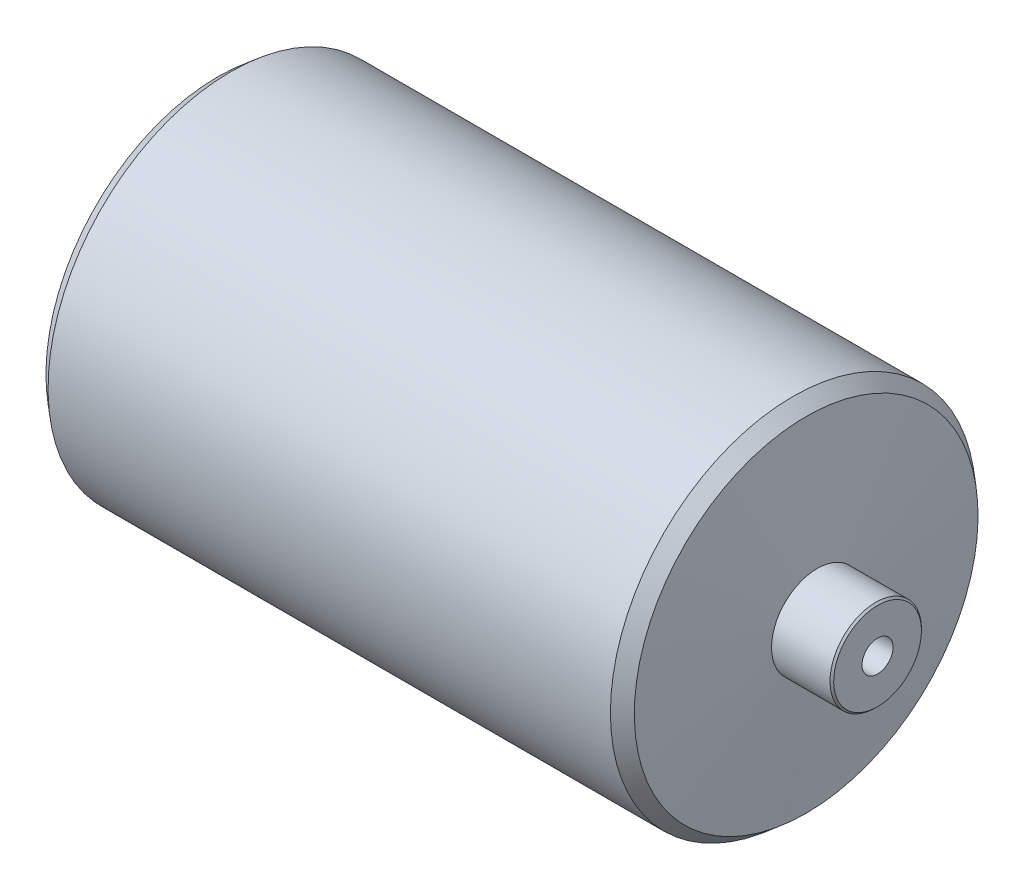
ISO-10303-21;
HEADER;
FILE_DESCRIPTION(('STEP AP214'),'2;1');
FILE_NAME('part.step','',(''),(''),'','','');
FILE_SCHEMA(('AUTOMOTIVE_DESIGN { 1 0 10303 214 1 1 1 1 }'));
ENDSEC;
DATA;
#1=APPLICATION_CONTEXT('core data for automotive mechanical design processes');
#2=APPLICATION_PROTOCOL_DEFINITION('international standard','automotive_design',2000,#1);
#3=PRODUCT_CONTEXT('',#1,'mechanical');
#4=PRODUCT('Part','Part','',(#3));
#5=PRODUCT_RELATED_PRODUCT_CATEGORY('part','',(#4));
#6=PRODUCT_DEFINITION_FORMATION('','',#4);
#7=PRODUCT_DEFINITION_CONTEXT('part definition',#1,'design');
#8=PRODUCT_DEFINITION('design','',#6,#7);
#9=PRODUCT_DEFINITION_SHAPE('','',#8);
#10=(LENGTH_UNIT() NAMED_UNIT(*) SI_UNIT(.MILLI.,.METRE.));
#11=(NAMED_UNIT(*) PLANE_ANGLE_UNIT() SI_UNIT($,.RADIAN.));
#12=(NAMED_UNIT(*) SI_UNIT($,.STERADIAN.) SOLID_ANGLE_UNIT());
#13=UNCERTAINTY_MEASURE_WITH_UNIT(LENGTH_MEASURE(1.E-05),#10,'distance_accuracy_value','');
#14=(GEOMETRIC_REPRESENTATION_CONTEXT(3) GLOBAL_UNCERTAINTY_ASSIGNED_CONTEXT((#13)) GLOBAL_UNIT_ASSIGNED_CONTEXT((#10,
#11,#12)) REPRESENTATION_CONTEXT('',''));
#15=CARTESIAN_POINT('',(0.,0.,0.));
#16=DIRECTION('',(0.,0.,1.));
#17=DIRECTION('',(1.,0.,0.));
#18=AXIS2_PLACEMENT_3D('',#15,#16,#17);
#19=CARTESIAN_POINT('',(0.,0.,0.));
#20=DIRECTION('',(-1.,0.,0.));
#21=DIRECTION('',(0.,-1.,0.));
#22=AXIS2_PLACEMENT_3D('',#19,#20,#21);
#23=PLANE('',#22);
#24=CARTESIAN_POINT('',(0.,0.,0.));
#25=DIRECTION('',(-1.,0.,0.));
#26=DIRECTION('',(0.,0.,1.));
#27=AXIS2_PLACEMENT_3D('',#24,#25,#26);
#28=CIRCLE('',#27,4.24999999999999);
#29=CARTESIAN_POINT('',(0.,0.,4.24999999999999));
#30=VERTEX_POINT('',#29);
#31=EDGE_CURVE('E62',#30,#30,#28,.T.);
#32=ORIENTED_EDGE('',*,*,#31,.F.);
#33=EDGE_LOOP('',(#32));
#34=FACE_BOUND('',#33,.T.);
#35=CARTESIAN_POINT('',(0.,0.,0.));
#36=DIRECTION('',(1.,0.,0.));
#37=DIRECTION('',(0.,1.,0.));
#38=AXIS2_PLACEMENT_3D('',#35,#36,#37);
#39=CIRCLE('',#38,12.);
#40=CARTESIAN_POINT('',(0.,12.,0.));
#41=VERTEX_POINT('',#40);
#42=EDGE_CURVE('E11',#41,#41,#39,.T.);
#43=ORIENTED_EDGE('',*,*,#42,.F.);
#44=EDGE_LOOP('',(#43));
#45=FACE_BOUND('',#44,.T.);
#46=ADVANCED_FACE('F38',(#34,#45),#23,.T.);
#47=CARTESIAN_POINT('',(0.5,0.,0.));
#48=DIRECTION('',(1.,0.,0.));
#49=DIRECTION('',(0.,1.,0.));
#50=AXIS2_PLACEMENT_3D('',#47,#48,#49);
#51=CONICAL_SURFACE('',#50,12.5,0.785398163397448);
#52=ORIENTED_EDGE('',*,*,#42,.T.);
#53=EDGE_LOOP('',(#52));
#54=FACE_BOUND('',#53,.T.);
#55=CARTESIAN_POINT('',(0.5,0.,0.));
#56=DIRECTION('',(1.,0.,0.));
#57=DIRECTION('',(0.,1.,0.));
#58=AXIS2_PLACEMENT_3D('',#55,#56,#57);
#59=CIRCLE('',#58,12.5);
#60=CARTESIAN_POINT('',(0.499999999999992,12.5,0.));
#61=VERTEX_POINT('',#60);
#62=EDGE_CURVE('E45',#61,#61,#59,.T.);
#63=ORIENTED_EDGE('',*,*,#62,.F.);
#64=EDGE_LOOP('',(#63));
#65=FACE_BOUND('',#64,.T.);
#66=ADVANCED_FACE('F101',(#54,#65),#51,.T.);
#67=CARTESIAN_POINT('',(200.,1.38777878078145E-13,0.));
#68=DIRECTION('',(1.,0.,0.));
#69=DIRECTION('',(0.,1.,0.));
#70=AXIS2_PLACEMENT_3D('',#67,#68,#69);
#71=CYLINDRICAL_SURFACE('',#70,12.5);
#72=ORIENTED_EDGE('',*,*,#62,.T.);
#73=EDGE_LOOP('',(#72));
#74=FACE_BOUND('',#73,.T.);
#75=CARTESIAN_POINT('',(16.5,0.,0.));
#76=DIRECTION('',(1.,0.,0.));
#77=DIRECTION('',(0.,1.,0.));
#78=AXIS2_PLACEMENT_3D('',#75,#76,#77);
#79=CIRCLE('',#78,12.5);
#80=CARTESIAN_POINT('',(16.5,12.5,0.));
#81=VERTEX_POINT('',#80);
#82=EDGE_CURVE('E93',#81,#81,#79,.T.);
#83=ORIENTED_EDGE('',*,*,#82,.F.);
#84=EDGE_LOOP('',(#83));
#85=FACE_BOUND('',#84,.T.);
#86=ADVANCED_FACE('F98',(#74,#85),#71,.T.);
#87=CARTESIAN_POINT('',(19.5193576539791,0.,0.));
#88=DIRECTION('',(1.,0.,0.));
#89=DIRECTION('',(0.,1.,0.));
#90=AXIS2_PLACEMENT_3D('',#87,#88,#89);
#91=CONICAL_SURFACE('',#90,47.0114159057247,1.48352986419518);
#92=CARTESIAN_POINT('',(19.5193576539791,0.,0.));
#93=DIRECTION('',(1.,0.,0.));
#94=DIRECTION('',(0.,1.,0.));
#95=AXIS2_PLACEMENT_3D('',#92,#93,#94);
#96=CIRCLE('',#95,47.0114159057247);
#97=CARTESIAN_POINT('',(19.519357653979,47.0114159057247,0.));
#98=VERTEX_POINT('',#97);
#99=EDGE_CURVE('E90',#98,#98,#96,.T.);
#100=CARTESIAN_POINT('',(16.5,12.5,0.));
#101=CARTESIAN_POINT('',(16.5314516422289,12.8594939156847,0.));
#102=CARTESIAN_POINT('',(16.5629032844579,13.2189878313693,0.));
#103=CARTESIAN_POINT('',(16.6258065689158,13.9379756627386,0.));
#104=CARTESIAN_POINT('',(16.6572582111447,14.2974695784232,0.));
#105=CARTESIAN_POINT('',(16.7201614956026,15.0164574097925,0.));
#106=CARTESIAN_POINT('',(16.7516131378316,15.3759513254771,0.));
#107=CARTESIAN_POINT('',(16.8145164222895,16.0949391568464,0.));
#108=CARTESIAN_POINT('',(16.8459680645184,16.454433072531,0.));
#109=CARTESIAN_POINT('',(16.9088713489763,17.1734209039003,0.));
#110=CARTESIAN_POINT('',(16.9403229912053,17.5329148195849,0.));
#111=CARTESIAN_POINT('',(17.0032262756632,18.2519026509542,0.));
#112=CARTESIAN_POINT('',(17.0346779178921,18.6113965666388,0.));
#113=CARTESIAN_POINT('',(17.09758120235,19.3303843980081,0.));
#114=CARTESIAN_POINT('',(17.129032844579,19.6898783136927,0.));
#115=CARTESIAN_POINT('',(17.1919361290368,20.408866145062,0.));
#116=CARTESIAN_POINT('',(17.2233877712658,20.7683600607466,0.));
#117=CARTESIAN_POINT('',(17.2862910557237,21.4873478921158,0.));
#118=CARTESIAN_POINT('',(17.3177426979526,21.8468418078005,0.));
#119=CARTESIAN_POINT('',(17.3806459824105,22.5658296391698,0.));
#120=CARTESIAN_POINT('',(17.4120976246395,22.9253235548544,0.));
#121=CARTESIAN_POINT('',(17.4750009090974,23.6443113862236,0.));
#122=CARTESIAN_POINT('',(17.5064525513263,24.0038053019083,0.));
#123=CARTESIAN_POINT('',(17.5693558357842,24.7227931332775,0.));
#124=CARTESIAN_POINT('',(17.6008074780132,25.0822870489622,0.));
#125=CARTESIAN_POINT('',(17.6637107624711,25.8012748803314,0.));
#126=CARTESIAN_POINT('',(17.6951624047,26.1607687960161,0.));
#127=CARTESIAN_POINT('',(17.7580656891579,26.8797566273853,0.));
#128=CARTESIAN_POINT('',(17.7895173313869,27.23925054307,0.));
#129=CARTESIAN_POINT('',(17.8524206158448,27.9582383744392,0.));
#130=CARTESIAN_POINT('',(17.8838722580737,28.3177322901239,0.));
#131=CARTESIAN_POINT('',(17.9467755425316,29.0367201214931,0.));
#132=CARTESIAN_POINT('',(17.9782271847606,29.3962140371778,0.));
#133=CARTESIAN_POINT('',(18.0411304692185,30.115201868547,0.));
#134=CARTESIAN_POINT('',(18.0725821114474,30.4746957842317,0.));
#135=CARTESIAN_POINT('',(18.1354853959053,31.1936836156009,0.));
#136=CARTESIAN_POINT('',(18.1669370381343,31.5531775312856,0.));
#137=CARTESIAN_POINT('',(18.2298403225922,32.2721653626548,0.));
#138=CARTESIAN_POINT('',(18.2612919648211,32.6316592783394,0.));
#139=CARTESIAN_POINT('',(18.324195249279,33.3506471097087,0.));
#140=CARTESIAN_POINT('',(18.3556468915079,33.7101410253933,0.));
#141=CARTESIAN_POINT('',(18.4185501759658,34.4291288567626,0.));
#142=CARTESIAN_POINT('',(18.4500018181948,34.7886227724472,0.));
#143=CARTESIAN_POINT('',(18.5129051026527,35.5076106038165,0.));
#144=CARTESIAN_POINT('',(18.5443567448816,35.8671045195011,0.));
#145=CARTESIAN_POINT('',(18.6072600293395,36.5860923508704,0.));
#146=CARTESIAN_POINT('',(18.6387116715685,36.945586266555,0.));
#147=CARTESIAN_POINT('',(18.7016149560264,37.6645740979243,0.));
#148=CARTESIAN_POINT('',(18.7330665982553,38.0240680136089,0.));
#149=CARTESIAN_POINT('',(18.7959698827132,38.7430558449782,0.));
#150=CARTESIAN_POINT('',(18.8274215249422,39.1025497606628,0.));
#151=CARTESIAN_POINT('',(18.8903248094001,39.8215375920321,0.));
#152=CARTESIAN_POINT('',(18.921776451629,40.1810315077167,0.));
#153=CARTESIAN_POINT('',(18.9846797360869,40.900019339086,0.));
#154=CARTESIAN_POINT('',(19.0161313783159,41.2595132547706,0.));
#155=CARTESIAN_POINT('',(19.0790346627738,41.9785010861399,0.));
#156=CARTESIAN_POINT('',(19.1104863050027,42.3379950018245,0.));
#157=CARTESIAN_POINT('',(19.1733895894606,43.0569828331938,0.));
#158=CARTESIAN_POINT('',(19.2048412316896,43.4164767488784,0.));
#159=CARTESIAN_POINT('',(19.2677445161475,44.1354645802477,0.));
#160=CARTESIAN_POINT('',(19.2991961583764,44.4949584959323,0.));
#161=CARTESIAN_POINT('',(19.3620994428343,45.2139463273016,0.));
#162=CARTESIAN_POINT('',(19.3935510850633,45.5734402429862,0.));
#163=CARTESIAN_POINT('',(19.4564543695212,46.2924280743555,0.));
#164=CARTESIAN_POINT('',(19.4879060117501,46.6519219900401,0.));
#165=CARTESIAN_POINT('',(19.519357653979,47.0114159057247,0.));
#166=B_SPLINE_CURVE_WITH_KNOTS('',3,(#100,#101,#102,#103,#104,#105,#106,#107,#108,#109,#110,
#111,#112,#113,#114,#115,#116,#117,#118,#119,#120,#121,#122,#123,#124,#125,#126,#127,#128,#129,
#130,#131,#132,#133,#134,#135,#136,#137,#138,#139,#140,#141,#142,#143,#144,#145,#146,#147,#148,
#149,#150,#151,#152,#153,#154,#155,#156,#157,#158,#159,#160,#161,#162,#163,#164,#165),
.UNSPECIFIED.,.F.,.F.,(4,2,2,2,2,2,2,2,2,2,2,2,2,2,2,2,2,2,2,2,2,2,2,2,2,2,2,2,2,2,2,2,4),(0.,
1.08260137212111,2.16520274424222,3.24780411636332,4.33040548848443,5.41300686060554,
6.49560823272665,7.57820960484776,8.66081097696886,9.74341234908997,10.8260137212111,
11.9086150933322,12.9912164654533,14.0738178375744,15.1564192096955,16.2390205818166,
17.3216219539377,18.4042233260588,19.4868246981799,20.569426070301,21.6520274424222,
22.7346288145433,23.8172301866644,24.8998315587855,25.9824329309066,27.0650343030277,
28.1476356751488,29.2302370472699,30.312838419391,31.3954397915121,32.4780411636332,
33.5606425357543,34.6432439078754),.UNSPECIFIED.);
#167=EDGE_CURVE('BSEAM108',#81,#98,#166,.T.);
#168=ORIENTED_EDGE('',*,*,#82,.T.);
#169=ORIENTED_EDGE('',*,*,#99,.F.);
#170=ORIENTED_EDGE('',*,*,#167,.T.);
#171=ORIENTED_EDGE('',*,*,#167,.F.);
#172=EDGE_LOOP('',(#168,#170,#169,#171));
#173=FACE_BOUND('',#172,.T.);
#174=ADVANCED_FACE('F108',(#173),#91,.T.);
#175=CARTESIAN_POINT('',(23.0810134851014,0.,0.));
#176=DIRECTION('',(1.,0.,0.));
#177=DIRECTION('',(0.,1.,0.));
#178=AXIS2_PLACEMENT_3D('',#175,#176,#177);
#179=CONICAL_SURFACE('',#178,50.,0.698131700797741);
#180=ORIENTED_EDGE('',*,*,#99,.T.);
#181=EDGE_LOOP('',(#180));
#182=FACE_BOUND('',#181,.T.);
#183=CARTESIAN_POINT('',(23.0810134851014,0.,0.));
#184=DIRECTION('',(1.,0.,0.));
#185=DIRECTION('',(0.,1.,0.));
#186=AXIS2_PLACEMENT_3D('',#183,#184,#185);
#187=CIRCLE('',#186,50.);
#188=CARTESIAN_POINT('',(23.0810134851014,50.,0.));
#189=VERTEX_POINT('',#188);
#190=EDGE_CURVE('E87',#189,#189,#187,.T.);
#191=ORIENTED_EDGE('',*,*,#190,.F.);
#192=EDGE_LOOP('',(#191));
#193=FACE_BOUND('',#192,.T.);
#194=ADVANCED_FACE('F114',(#182,#193),#179,.T.);
#195=CARTESIAN_POINT('',(200.,1.38777878078145E-13,0.));
#196=DIRECTION('',(1.,0.,0.));
#197=DIRECTION('',(0.,1.,0.));
#198=AXIS2_PLACEMENT_3D('',#195,#196,#197);
#199=CYLINDRICAL_SURFACE('',#198,50.);
#200=ORIENTED_EDGE('',*,*,#190,.T.);
#201=EDGE_LOOP('',(#200));
#202=FACE_BOUND('',#201,.T.);
#203=CARTESIAN_POINT('',(176.918986514899,1.22762207701367E-13,0.));
#204=DIRECTION('',(1.,0.,0.));
#205=DIRECTION('',(0.,1.,0.));
#206=AXIS2_PLACEMENT_3D('',#203,#204,#205);
#207=CIRCLE('',#206,50.);
#208=CARTESIAN_POINT('',(176.918986514899,50.0000000000001,0.));
#209=VERTEX_POINT('',#208);
#210=EDGE_CURVE('E84',#209,#209,#207,.T.);
#211=ORIENTED_EDGE('',*,*,#210,.F.);
#212=EDGE_LOOP('',(#211));
#213=FACE_BOUND('',#212,.T.);
#214=ADVANCED_FACE('F118',(#202,#213),#199,.T.);
#215=CARTESIAN_POINT('',(180.480642346021,1.25233602894807E-13,0.));
#216=DIRECTION('',(-1.,0.,0.));
#217=DIRECTION('',(0.,-1.,0.));
#218=AXIS2_PLACEMENT_3D('',#215,#216,#217);
#219=CONICAL_SURFACE('',#218,47.0114159057247,0.698131700797735);
#220=ORIENTED_EDGE('',*,*,#210,.T.);
#221=EDGE_LOOP('',(#220));
#222=FACE_BOUND('',#221,.T.);
#223=CARTESIAN_POINT('',(180.480642346021,1.25233602894807E-13,0.));
#224=DIRECTION('',(1.,0.,0.));
#225=DIRECTION('',(0.,1.,0.));
#226=AXIS2_PLACEMENT_3D('',#223,#224,#225);
#227=CIRCLE('',#226,47.0114159057247);
#228=CARTESIAN_POINT('',(180.480642346021,-47.0114159057245,0.));
#229=VERTEX_POINT('',#228);
#230=EDGE_CURVE('E81',#229,#229,#227,.T.);
#231=ORIENTED_EDGE('',*,*,#230,.F.);
#232=EDGE_LOOP('',(#231));
#233=FACE_BOUND('',#232,.T.);
#234=ADVANCED_FACE('F122',(#222,#233),#219,.T.);
#235=CARTESIAN_POINT('',(183.5,1.27328703136698E-13,0.));
#236=DIRECTION('',(-1.,0.,0.));
#237=DIRECTION('',(0.,-1.,0.));
#238=AXIS2_PLACEMENT_3D('',#235,#236,#237);
#239=CONICAL_SURFACE('',#238,12.5,1.48352986419518);
#240=CARTESIAN_POINT('',(183.5,1.27328703136698E-13,0.));
#241=DIRECTION('',(1.,0.,0.));
#242=DIRECTION('',(0.,1.,0.));
#243=AXIS2_PLACEMENT_3D('',#240,#241,#242);
#244=CIRCLE('',#243,12.5);
#245=CARTESIAN_POINT('',(183.5,-12.4999999999997,0.));
#246=VERTEX_POINT('',#245);
#247=EDGE_CURVE('E78',#246,#246,#244,.T.);
#248=CARTESIAN_POINT('',(180.480642346021,-47.0114159057245,0.));
#249=CARTESIAN_POINT('',(180.51209398825,-46.6519219900398,0.));
#250=CARTESIAN_POINT('',(180.543545630479,-46.2924280743552,0.));
#251=CARTESIAN_POINT('',(180.606448914937,-45.5734402429859,0.));
#252=CARTESIAN_POINT('',(180.637900557166,-45.2139463273013,0.));
#253=CARTESIAN_POINT('',(180.700803841624,-44.494958495932,0.));
#254=CARTESIAN_POINT('',(180.732255483853,-44.1354645802474,0.));
#255=CARTESIAN_POINT('',(180.795158768311,-43.4164767488781,0.));
#256=CARTESIAN_POINT('',(180.826610410539,-43.0569828331935,0.));
#257=CARTESIAN_POINT('',(180.889513694997,-42.3379950018242,0.));
#258=CARTESIAN_POINT('',(180.920965337226,-41.9785010861396,0.));
#259=CARTESIAN_POINT('',(180.983868621684,-41.2595132547703,0.));
#260=CARTESIAN_POINT('',(181.015320263913,-40.9000193390857,0.));
#261=CARTESIAN_POINT('',(181.078223548371,-40.1810315077164,0.));
#262=CARTESIAN_POINT('',(181.1096751906,-39.8215375920318,0.));
#263=CARTESIAN_POINT('',(181.172578475058,-39.1025497606625,0.));
#264=CARTESIAN_POINT('',(181.204030117287,-38.7430558449779,0.));
#265=CARTESIAN_POINT('',(181.266933401745,-38.0240680136086,0.));
#266=CARTESIAN_POINT('',(181.298385043974,-37.664574097924,0.));
#267=CARTESIAN_POINT('',(181.361288328432,-36.9455862665547,0.));
#268=CARTESIAN_POINT('',(181.392739970661,-36.5860923508701,0.));
#269=CARTESIAN_POINT('',(181.455643255118,-35.8671045195008,0.));
#270=CARTESIAN_POINT('',(181.487094897347,-35.5076106038162,0.));
#271=CARTESIAN_POINT('',(181.549998181805,-34.7886227724469,0.));
#272=CARTESIAN_POINT('',(181.581449824034,-34.4291288567623,0.));
#273=CARTESIAN_POINT('',(181.644353108492,-33.710141025393,0.));
#274=CARTESIAN_POINT('',(181.675804750721,-33.3506471097084,0.));
#275=CARTESIAN_POINT('',(181.738708035179,-32.6316592783391,0.));
#276=CARTESIAN_POINT('',(181.770159677408,-32.2721653626545,0.));
#277=CARTESIAN_POINT('',(181.833062961866,-31.5531775312852,0.));
#278=CARTESIAN_POINT('',(181.864514604095,-31.1936836156006,0.));
#279=CARTESIAN_POINT('',(181.927417888553,-30.4746957842313,0.));
#280=CARTESIAN_POINT('',(181.958869530782,-30.1152018685467,0.));
#281=CARTESIAN_POINT('',(182.021772815239,-29.3962140371775,0.));
#282=CARTESIAN_POINT('',(182.053224457468,-29.0367201214928,0.));
#283=CARTESIAN_POINT('',(182.116127741926,-28.3177322901236,0.));
#284=CARTESIAN_POINT('',(182.147579384155,-27.9582383744389,0.));
#285=CARTESIAN_POINT('',(182.210482668613,-27.2392505430697,0.));
#286=CARTESIAN_POINT('',(182.241934310842,-26.879756627385,0.));
#287=CARTESIAN_POINT('',(182.3048375953,-26.1607687960158,0.));
#288=CARTESIAN_POINT('',(182.336289237529,-25.8012748803311,0.));
#289=CARTESIAN_POINT('',(182.399192521987,-25.0822870489619,0.));
#290=CARTESIAN_POINT('',(182.430644164216,-24.7227931332772,0.));
#291=CARTESIAN_POINT('',(182.493547448674,-24.003805301908,0.));
#292=CARTESIAN_POINT('',(182.524999090903,-23.6443113862233,0.));
#293=CARTESIAN_POINT('',(182.587902375361,-22.9253235548541,0.));
#294=CARTESIAN_POINT('',(182.61935401759,-22.5658296391694,0.));
#295=CARTESIAN_POINT('',(182.682257302047,-21.8468418078002,0.));
#296=CARTESIAN_POINT('',(182.713708944276,-21.4873478921155,0.));
#297=CARTESIAN_POINT('',(182.776612228734,-20.7683600607463,0.));
#298=CARTESIAN_POINT('',(182.808063870963,-20.4088661450616,0.));
#299=CARTESIAN_POINT('',(182.870967155421,-19.6898783136924,0.));
#300=CARTESIAN_POINT('',(182.90241879765,-19.3303843980077,0.));
#301=CARTESIAN_POINT('',(182.965322082108,-18.6113965666385,0.));
#302=CARTESIAN_POINT('',(182.996773724337,-18.2519026509538,0.));
#303=CARTESIAN_POINT('',(183.059677008795,-17.5329148195846,0.));
#304=CARTESIAN_POINT('',(183.091128651024,-17.1734209038999,0.));
#305=CARTESIAN_POINT('',(183.154031935482,-16.4544330725307,0.));
#306=CARTESIAN_POINT('',(183.185483577711,-16.094939156846,0.));
#307=CARTESIAN_POINT('',(183.248386862168,-15.3759513254768,0.));
#308=CARTESIAN_POINT('',(183.279838504397,-15.0164574097921,0.));
#309=CARTESIAN_POINT('',(183.342741788855,-14.2974695784229,0.));
#310=CARTESIAN_POINT('',(183.374193431084,-13.9379756627382,0.));
#311=CARTESIAN_POINT('',(183.437096715542,-13.218987831369,0.));
#312=CARTESIAN_POINT('',(183.468548357771,-12.8594939156843,0.));
#313=CARTESIAN_POINT('',(183.5,-12.4999999999997,0.));
#314=B_SPLINE_CURVE_WITH_KNOTS('',3,(#248,#249,#250,#251,#252,#253,#254,#255,#256,#257,#258,
#259,#260,#261,#262,#263,#264,#265,#266,#267,#268,#269,#270,#271,#272,#273,#274,#275,#276,#277,
#278,#279,#280,#281,#282,#283,#284,#285,#286,#287,#288,#289,#290,#291,#292,#293,#294,#295,#296,
#297,#298,#299,#300,#301,#302,#303,#304,#305,#306,#307,#308,#309,#310,#311,#312,#313),
.UNSPECIFIED.,.F.,.F.,(4,2,2,2,2,2,2,2,2,2,2,2,2,2,2,2,2,2,2,2,2,2,2,2,2,2,2,2,2,2,2,2,4),(0.,
1.08260137212111,2.16520274424222,3.24780411636333,4.33040548848443,5.41300686060554,
6.49560823272665,7.57820960484776,8.66081097696887,9.74341234908998,10.8260137212111,
11.9086150933322,12.9912164654533,14.0738178375744,15.1564192096955,16.2390205818166,
17.3216219539378,18.4042233260589,19.48682469818,20.5694260703011,21.6520274424222,
22.7346288145433,23.8172301866644,24.8998315587855,25.9824329309066,27.0650343030277,
28.1476356751488,29.23023704727,30.3128384193911,31.3954397915122,32.4780411636333,
33.5606425357544,34.6432439078755),.UNSPECIFIED.);
#315=EDGE_CURVE('BSEAM126',#229,#246,#314,.T.);
#316=ORIENTED_EDGE('',*,*,#230,.T.);
#317=ORIENTED_EDGE('',*,*,#247,.F.);
#318=ORIENTED_EDGE('',*,*,#315,.T.);
#319=ORIENTED_EDGE('',*,*,#315,.F.);
#320=EDGE_LOOP('',(#316,#318,#317,#319));
#321=FACE_BOUND('',#320,.T.);
#322=ADVANCED_FACE('F126',(#321),#239,.T.);
#323=CARTESIAN_POINT('',(200.,1.38777878078145E-13,0.));
#324=DIRECTION('',(1.,0.,0.));
#325=DIRECTION('',(0.,1.,0.));
#326=AXIS2_PLACEMENT_3D('',#323,#324,#325);
#327=CYLINDRICAL_SURFACE('',#326,12.5);
#328=ORIENTED_EDGE('',*,*,#247,.T.);
#329=EDGE_LOOP('',(#328));
#330=FACE_BOUND('',#329,.T.);
#331=CARTESIAN_POINT('',(199.5,1.38430933382949E-13,0.));
#332=DIRECTION('',(1.,0.,0.));
#333=DIRECTION('',(0.,1.,0.));
#334=AXIS2_PLACEMENT_3D('',#331,#332,#333);
#335=CIRCLE('',#334,12.5);
#336=CARTESIAN_POINT('',(199.5,12.5000000000001,0.));
#337=VERTEX_POINT('',#336);
#338=EDGE_CURVE('E75',#337,#337,#335,.T.);
#339=ORIENTED_EDGE('',*,*,#338,.F.);
#340=EDGE_LOOP('',(#339));
#341=FACE_BOUND('',#340,.T.);
#342=ADVANCED_FACE('F130',(#330,#341),#327,.T.);
#343=CARTESIAN_POINT('',(200.,1.38777878078145E-13,0.));
#344=DIRECTION('',(-1.,0.,0.));
#345=DIRECTION('',(0.,-1.,0.));
#346=AXIS2_PLACEMENT_3D('',#343,#344,#345);
#347=CONICAL_SURFACE('',#346,12.,0.785398163397421);
#348=ORIENTED_EDGE('',*,*,#338,.T.);
#349=EDGE_LOOP('',(#348));
#350=FACE_BOUND('',#349,.T.);
#351=CARTESIAN_POINT('',(200.,1.38777878078145E-13,0.));
#352=DIRECTION('',(1.,0.,0.));
#353=DIRECTION('',(0.,1.,0.));
#354=AXIS2_PLACEMENT_3D('',#351,#352,#353);
#355=CIRCLE('',#354,12.);
#356=CARTESIAN_POINT('',(200.,12.0000000000001,0.));
#357=VERTEX_POINT('',#356);
#358=EDGE_CURVE('E72',#357,#357,#355,.T.);
#359=ORIENTED_EDGE('',*,*,#358,.F.);
#360=EDGE_LOOP('',(#359));
#361=FACE_BOUND('',#360,.T.);
#362=ADVANCED_FACE('F134',(#350,#361),#347,.T.);
#363=CARTESIAN_POINT('',(200.,1.38777878078145E-13,0.));
#364=DIRECTION('',(1.,0.,0.));
#365=DIRECTION('',(0.,1.,0.));
#366=AXIS2_PLACEMENT_3D('',#363,#364,#365);
#367=PLANE('',#366);
#368=CARTESIAN_POINT('',(200.,1.38777878078145E-13,0.));
#369=DIRECTION('',(1.,0.,0.));
#370=DIRECTION('',(0.,0.,-1.));
#371=AXIS2_PLACEMENT_3D('',#368,#369,#370);
#372=CIRCLE('',#371,4.24999999999999);
#373=CARTESIAN_POINT('',(200.,1.38777878078145E-13,-4.24999999999999));
#374=VERTEX_POINT('',#373);
#375=EDGE_CURVE('E61',#374,#374,#372,.T.);
#376=ORIENTED_EDGE('',*,*,#375,.F.);
#377=EDGE_LOOP('',(#376));
#378=FACE_BOUND('',#377,.T.);
#379=ORIENTED_EDGE('',*,*,#358,.T.);
#380=EDGE_LOOP('',(#379));
#381=FACE_BOUND('',#380,.T.);
#382=ADVANCED_FACE('F138',(#378,#381),#367,.T.);
#383=CARTESIAN_POINT('',(143.553657630867,1.38777878078145E-13,0.));
#384=DIRECTION('',(1.,0.,0.));
#385=DIRECTION('',(0.,0.,-1.));
#386=AXIS2_PLACEMENT_3D('',#383,#384,#385);
#387=CONICAL_SURFACE('',#386,4.24999999999999,1.02974425867665);
#388=CARTESIAN_POINT('',(141.,1.24032728532342E-13,0.));
#389=VERTEX_POINT('',#388);
#390=VERTEX_LOOP('',#389);
#391=FACE_BOUND('',#390,.T.);
#392=CARTESIAN_POINT('',(143.553657630867,1.38777878078145E-13,0.));
#393=DIRECTION('',(1.,0.,0.));
#394=DIRECTION('',(0.,0.,-1.));
#395=AXIS2_PLACEMENT_3D('',#392,#393,#394);
#396=CIRCLE('',#395,4.24999999999999);
#397=CARTESIAN_POINT('',(143.553657630867,1.38777878078145E-13,-4.24999999999999));
#398=VERTEX_POINT('',#397);
#399=EDGE_CURVE('E65',#398,#398,#396,.T.);
#400=ORIENTED_EDGE('',*,*,#399,.T.);
#401=EDGE_LOOP('',(#400));
#402=FACE_BOUND('',#401,.T.);
#403=ADVANCED_FACE('F142',(#391,#402),#387,.F.);
#404=CARTESIAN_POINT('',(200.,1.38777878078145E-13,0.));
#405=DIRECTION('',(1.,0.,0.));
#406=DIRECTION('',(0.,0.,-1.));
#407=AXIS2_PLACEMENT_3D('',#404,#405,#406);
#408=CYLINDRICAL_SURFACE('',#407,4.24999999999999);
#409=ORIENTED_EDGE('',*,*,#399,.F.);
#410=EDGE_LOOP('',(#409));
#411=FACE_BOUND('',#410,.T.);
#412=ORIENTED_EDGE('',*,*,#375,.T.);
#413=EDGE_LOOP('',(#412));
#414=FACE_BOUND('',#413,.T.);
#415=ADVANCED_FACE('F55',(#411,#414),#408,.F.);
#416=CARTESIAN_POINT('',(56.4463423691329,0.,0.));
#417=DIRECTION('',(-1.,0.,0.));
#418=DIRECTION('',(0.,0.,1.));
#419=AXIS2_PLACEMENT_3D('',#416,#417,#418);
#420=CONICAL_SURFACE('',#419,4.24999999999999,1.02974425867665);
#421=CARTESIAN_POINT('',(59.,0.,0.));
#422=VERTEX_POINT('',#421);
#423=VERTEX_LOOP('',#422);
#424=FACE_BOUND('',#423,.T.);
#425=CARTESIAN_POINT('',(56.4463423691329,0.,0.));
#426=DIRECTION('',(-1.,0.,0.));
#427=DIRECTION('',(0.,0.,1.));
#428=AXIS2_PLACEMENT_3D('',#425,#426,#427);
#429=CIRCLE('',#428,4.24999999999999);
#430=CARTESIAN_POINT('',(56.4463423691329,0.,4.24999999999999));
#431=VERTEX_POINT('',#430);
#432=EDGE_CURVE('E59',#431,#431,#429,.T.);
#433=ORIENTED_EDGE('',*,*,#432,.T.);
#434=EDGE_LOOP('',(#433));
#435=FACE_BOUND('',#434,.T.);
#436=ADVANCED_FACE('F51',(#424,#435),#420,.F.);
#437=CARTESIAN_POINT('',(0.,0.,0.));
#438=DIRECTION('',(-1.,0.,0.));
#439=DIRECTION('',(0.,0.,1.));
#440=AXIS2_PLACEMENT_3D('',#437,#438,#439);
#441=CYLINDRICAL_SURFACE('',#440,4.24999999999999);
#442=ORIENTED_EDGE('',*,*,#432,.F.);
#443=EDGE_LOOP('',(#442));
#444=FACE_BOUND('',#443,.T.);
#445=ORIENTED_EDGE('',*,*,#31,.T.);
#446=EDGE_LOOP('',(#445));
#447=FACE_BOUND('',#446,.T.);
#448=ADVANCED_FACE('F54',(#444,#447),#441,.F.);
#449=CLOSED_SHELL('',(#46,#66,#86,#174,#194,#214,#234,#322,#342,#362,#382,#403,#415,#436,#448));
#450=MANIFOLD_SOLID_BREP('B2',#449);
#451=ADVANCED_BREP_SHAPE_REPRESENTATION('',(#18,#450),#14);
#452=SHAPE_DEFINITION_REPRESENTATION(#9,#451);
ENDSEC;
END-ISO-10303-21;
